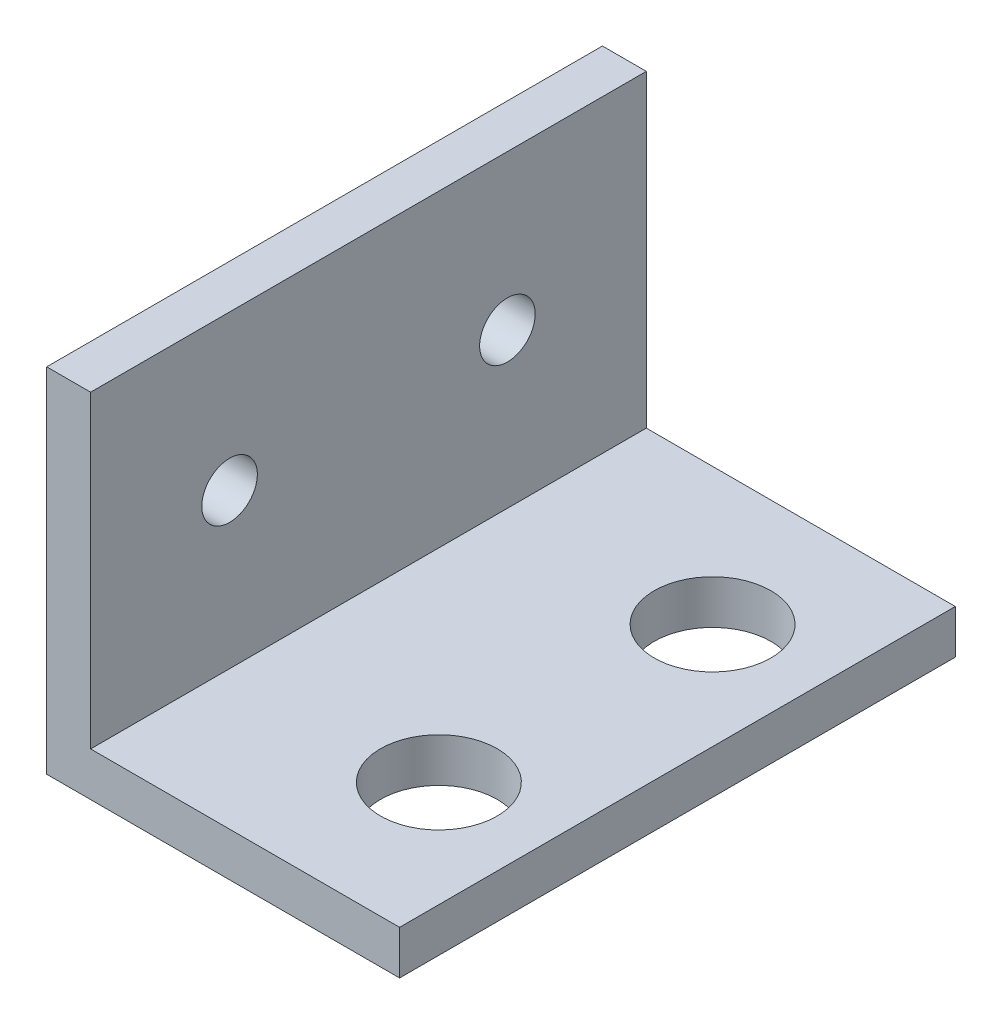
ISO-10303-21;
HEADER;
FILE_DESCRIPTION(('STEP AP214'),'2;1');
FILE_NAME('part.step','',(''),(''),'','','');
FILE_SCHEMA(('AUTOMOTIVE_DESIGN { 1 0 10303 214 1 1 1 1 }'));
ENDSEC;
DATA;
#1=APPLICATION_CONTEXT('core data for automotive mechanical design processes');
#2=APPLICATION_PROTOCOL_DEFINITION('international standard','automotive_design',2000,#1);
#3=PRODUCT_CONTEXT('',#1,'mechanical');
#4=PRODUCT('Part','Part','',(#3));
#5=PRODUCT_RELATED_PRODUCT_CATEGORY('part','',(#4));
#6=PRODUCT_DEFINITION_FORMATION('','',#4);
#7=PRODUCT_DEFINITION_CONTEXT('part definition',#1,'design');
#8=PRODUCT_DEFINITION('design','',#6,#7);
#9=PRODUCT_DEFINITION_SHAPE('','',#8);
#10=(LENGTH_UNIT() NAMED_UNIT(*) SI_UNIT(.MILLI.,.METRE.));
#11=(NAMED_UNIT(*) PLANE_ANGLE_UNIT() SI_UNIT($,.RADIAN.));
#12=(NAMED_UNIT(*) SI_UNIT($,.STERADIAN.) SOLID_ANGLE_UNIT());
#13=UNCERTAINTY_MEASURE_WITH_UNIT(LENGTH_MEASURE(1.E-05),#10,'distance_accuracy_value','');
#14=(GEOMETRIC_REPRESENTATION_CONTEXT(3) GLOBAL_UNCERTAINTY_ASSIGNED_CONTEXT((#13)) GLOBAL_UNIT_ASSIGNED_CONTEXT((#10,
#11,#12)) REPRESENTATION_CONTEXT('',''));
#15=CARTESIAN_POINT('',(0.,0.,0.));
#16=DIRECTION('',(0.,0.,1.));
#17=DIRECTION('',(1.,0.,0.));
#18=AXIS2_PLACEMENT_3D('',#15,#16,#17);
#19=CARTESIAN_POINT('',(0.,0.,20.));
#20=DIRECTION('',(0.,1.,0.));
#21=DIRECTION('',(0.,0.,1.));
#22=AXIS2_PLACEMENT_3D('',#19,#20,#21);
#23=PLANE('',#22);
#24=CARTESIAN_POINT('',(8.88885438200887,0.,4.9250000000029));
#25=DIRECTION('',(0.,-1.,0.));
#26=DIRECTION('',(0.,0.,-1.));
#27=AXIS2_PLACEMENT_3D('',#24,#25,#26);
#28=CIRCLE('',#27,2.10000000000005);
#29=CARTESIAN_POINT('',(8.88885438200887,0.,2.82500000000285));
#30=VERTEX_POINT('',#29);
#31=EDGE_CURVE('E166',#30,#30,#28,.T.);
#32=ORIENTED_EDGE('',*,*,#31,.F.);
#33=EDGE_LOOP('',(#32));
#34=FACE_BOUND('',#33,.T.);
#35=CARTESIAN_POINT('',(8.88885438200895,0.,14.7750000000034));
#36=DIRECTION('',(0.,-1.,0.));
#37=DIRECTION('',(0.,0.,-1.));
#38=AXIS2_PLACEMENT_3D('',#35,#36,#37);
#39=CIRCLE('',#38,2.10000000000014);
#40=CARTESIAN_POINT('',(8.88885438200895,0.,12.6750000000033));
#41=VERTEX_POINT('',#40);
#42=EDGE_CURVE('E169',#41,#41,#39,.T.);
#43=ORIENTED_EDGE('',*,*,#42,.F.);
#44=EDGE_LOOP('',(#43));
#45=FACE_BOUND('',#44,.T.);
#46=DIRECTION('',(1.,0.,0.));
#47=VECTOR('',#46,1.);
#48=CARTESIAN_POINT('',(0.,0.,0.));
#49=LINE('',#48,#47);
#50=CARTESIAN_POINT('',(0.,0.,0.));
#51=VERTEX_POINT('',#50);
#52=CARTESIAN_POINT('',(12.7,0.,0.));
#53=VERTEX_POINT('',#52);
#54=EDGE_CURVE('E120',#51,#53,#49,.T.);
#55=ORIENTED_EDGE('',*,*,#54,.T.);
#56=DIRECTION('',(0.,0.,-1.));
#57=VECTOR('',#56,1.);
#58=CARTESIAN_POINT('',(12.7,0.,20.));
#59=LINE('',#58,#57);
#60=CARTESIAN_POINT('',(12.7,0.,20.));
#61=VERTEX_POINT('',#60);
#62=EDGE_CURVE('E11',#61,#53,#59,.T.);
#63=ORIENTED_EDGE('',*,*,#62,.F.);
#64=DIRECTION('',(1.,0.,0.));
#65=VECTOR('',#64,1.);
#66=CARTESIAN_POINT('',(0.,0.,20.));
#67=LINE('',#66,#65);
#68=CARTESIAN_POINT('',(0.,0.,20.));
#69=VERTEX_POINT('',#68);
#70=EDGE_CURVE('E131',#69,#61,#67,.T.);
#71=ORIENTED_EDGE('',*,*,#70,.F.);
#72=DIRECTION('',(0.,0.,-1.));
#73=VECTOR('',#72,1.);
#74=CARTESIAN_POINT('',(0.,0.,20.));
#75=LINE('',#74,#73);
#76=EDGE_CURVE('E116',#69,#51,#75,.T.);
#77=ORIENTED_EDGE('',*,*,#76,.T.);
#78=EDGE_LOOP('',(#55,#63,#71,#77));
#79=FACE_BOUND('',#78,.T.);
#80=ADVANCED_FACE('F36',(#34,#45,#79),#23,.F.);
#81=CARTESIAN_POINT('',(12.7,1.58,20.));
#82=DIRECTION('',(-1.,0.,0.));
#83=DIRECTION('',(0.,0.,1.));
#84=AXIS2_PLACEMENT_3D('',#81,#82,#83);
#85=PLANE('',#84);
#86=DIRECTION('',(0.,1.,0.));
#87=VECTOR('',#86,1.);
#88=CARTESIAN_POINT('',(12.7,1.58,0.));
#89=LINE('',#88,#87);
#90=CARTESIAN_POINT('',(12.7,1.58,0.));
#91=VERTEX_POINT('',#90);
#92=EDGE_CURVE('E123',#53,#91,#89,.T.);
#93=ORIENTED_EDGE('',*,*,#92,.T.);
#94=DIRECTION('',(0.,0.,-1.));
#95=VECTOR('',#94,1.);
#96=CARTESIAN_POINT('',(12.7,1.58,20.));
#97=LINE('',#96,#95);
#98=CARTESIAN_POINT('',(12.7,1.58,20.));
#99=VERTEX_POINT('',#98);
#100=EDGE_CURVE('E44',#99,#91,#97,.T.);
#101=ORIENTED_EDGE('',*,*,#100,.F.);
#102=DIRECTION('',(0.,1.,0.));
#103=VECTOR('',#102,1.);
#104=CARTESIAN_POINT('',(12.7,1.58,20.));
#105=LINE('',#104,#103);
#106=EDGE_CURVE('E89',#61,#99,#105,.T.);
#107=ORIENTED_EDGE('',*,*,#106,.F.);
#108=ORIENTED_EDGE('',*,*,#62,.T.);
#109=EDGE_LOOP('',(#93,#101,#107,#108));
#110=FACE_BOUND('',#109,.T.);
#111=ADVANCED_FACE('F158',(#110),#85,.F.);
#112=CARTESIAN_POINT('',(1.58,1.58,20.));
#113=DIRECTION('',(0.,-1.,0.));
#114=DIRECTION('',(0.,0.,-1.));
#115=AXIS2_PLACEMENT_3D('',#112,#113,#114);
#116=PLANE('',#115);
#117=CARTESIAN_POINT('',(8.88885438200887,1.58,4.9250000000029));
#118=DIRECTION('',(0.,-1.,0.));
#119=DIRECTION('',(0.,0.,-1.));
#120=AXIS2_PLACEMENT_3D('',#117,#118,#119);
#121=CIRCLE('',#120,2.10000000000005);
#122=CARTESIAN_POINT('',(8.88885438200887,1.58,2.82500000000285));
#123=VERTEX_POINT('',#122);
#124=EDGE_CURVE('E176',#123,#123,#121,.F.);
#125=ORIENTED_EDGE('',*,*,#124,.F.);
#126=EDGE_LOOP('',(#125));
#127=FACE_BOUND('',#126,.T.);
#128=CARTESIAN_POINT('',(8.88885438200895,1.58,14.7750000000034));
#129=DIRECTION('',(0.,-1.,0.));
#130=DIRECTION('',(0.,0.,-1.));
#131=AXIS2_PLACEMENT_3D('',#128,#129,#130);
#132=CIRCLE('',#131,2.10000000000014);
#133=CARTESIAN_POINT('',(8.88885438200895,1.58,12.6750000000033));
#134=VERTEX_POINT('',#133);
#135=EDGE_CURVE('E171',#134,#134,#132,.F.);
#136=ORIENTED_EDGE('',*,*,#135,.F.);
#137=EDGE_LOOP('',(#136));
#138=FACE_BOUND('',#137,.T.);
#139=DIRECTION('',(-1.,0.,0.));
#140=VECTOR('',#139,1.);
#141=CARTESIAN_POINT('',(1.58,1.58,0.));
#142=LINE('',#141,#140);
#143=CARTESIAN_POINT('',(1.58,1.58,0.));
#144=VERTEX_POINT('',#143);
#145=EDGE_CURVE('E126',#91,#144,#142,.T.);
#146=ORIENTED_EDGE('',*,*,#145,.T.);
#147=DIRECTION('',(0.,0.,-1.));
#148=VECTOR('',#147,1.);
#149=CARTESIAN_POINT('',(1.58,1.58,20.));
#150=LINE('',#149,#148);
#151=CARTESIAN_POINT('',(1.58,1.58,20.));
#152=VERTEX_POINT('',#151);
#153=EDGE_CURVE('E111',#152,#144,#150,.T.);
#154=ORIENTED_EDGE('',*,*,#153,.F.);
#155=DIRECTION('',(-1.,0.,0.));
#156=VECTOR('',#155,1.);
#157=CARTESIAN_POINT('',(1.58,1.58,20.));
#158=LINE('',#157,#156);
#159=EDGE_CURVE('E102',#99,#152,#158,.T.);
#160=ORIENTED_EDGE('',*,*,#159,.F.);
#161=ORIENTED_EDGE('',*,*,#100,.T.);
#162=EDGE_LOOP('',(#146,#154,#160,#161));
#163=FACE_BOUND('',#162,.T.);
#164=ADVANCED_FACE('F137',(#127,#138,#163),#116,.F.);
#165=CARTESIAN_POINT('',(1.58,1.58,20.));
#166=DIRECTION('',(-1.,0.,0.));
#167=DIRECTION('',(0.,0.,1.));
#168=AXIS2_PLACEMENT_3D('',#165,#166,#167);
#169=PLANE('',#168);
#170=CARTESIAN_POINT('',(1.58,7.14,5.));
#171=DIRECTION('',(-1.,0.,0.));
#172=DIRECTION('',(0.,0.,1.));
#173=AXIS2_PLACEMENT_3D('',#170,#171,#172);
#174=CIRCLE('',#173,1.);
#175=CARTESIAN_POINT('',(1.58,7.14,6.));
#176=VERTEX_POINT('',#175);
#177=EDGE_CURVE('E124',#176,#176,#174,.F.);
#178=ORIENTED_EDGE('',*,*,#177,.F.);
#179=EDGE_LOOP('',(#178));
#180=FACE_BOUND('',#179,.T.);
#181=CARTESIAN_POINT('',(1.58,7.14,15.));
#182=DIRECTION('',(-1.,0.,0.));
#183=DIRECTION('',(0.,0.,1.));
#184=AXIS2_PLACEMENT_3D('',#181,#182,#183);
#185=CIRCLE('',#184,1.);
#186=CARTESIAN_POINT('',(1.58,7.14,16.));
#187=VERTEX_POINT('',#186);
#188=EDGE_CURVE('E182',#187,#187,#185,.F.);
#189=ORIENTED_EDGE('',*,*,#188,.F.);
#190=EDGE_LOOP('',(#189));
#191=FACE_BOUND('',#190,.T.);
#192=DIRECTION('',(0.,1.,0.));
#193=VECTOR('',#192,1.);
#194=CARTESIAN_POINT('',(1.58,1.58,0.));
#195=LINE('',#194,#193);
#196=CARTESIAN_POINT('',(1.58,12.7,0.));
#197=VERTEX_POINT('',#196);
#198=EDGE_CURVE('E110',#144,#197,#195,.T.);
#199=ORIENTED_EDGE('',*,*,#198,.T.);
#200=DIRECTION('',(0.,0.,-1.));
#201=VECTOR('',#200,1.);
#202=CARTESIAN_POINT('',(1.58,12.7,20.));
#203=LINE('',#202,#201);
#204=CARTESIAN_POINT('',(1.58,12.7,20.));
#205=VERTEX_POINT('',#204);
#206=EDGE_CURVE('E107',#205,#197,#203,.T.);
#207=ORIENTED_EDGE('',*,*,#206,.F.);
#208=DIRECTION('',(0.,1.,0.));
#209=VECTOR('',#208,1.);
#210=CARTESIAN_POINT('',(1.58,1.58,20.));
#211=LINE('',#210,#209);
#212=EDGE_CURVE('E96',#152,#205,#211,.T.);
#213=ORIENTED_EDGE('',*,*,#212,.F.);
#214=ORIENTED_EDGE('',*,*,#153,.T.);
#215=EDGE_LOOP('',(#199,#207,#213,#214));
#216=FACE_BOUND('',#215,.T.);
#217=ADVANCED_FACE('F108',(#180,#191,#216),#169,.F.);
#218=CARTESIAN_POINT('',(0.,12.7,20.));
#219=DIRECTION('',(0.,-1.,0.));
#220=DIRECTION('',(0.,0.,-1.));
#221=AXIS2_PLACEMENT_3D('',#218,#219,#220);
#222=PLANE('',#221);
#223=DIRECTION('',(-1.,0.,0.));
#224=VECTOR('',#223,1.);
#225=CARTESIAN_POINT('',(0.,12.7,0.));
#226=LINE('',#225,#224);
#227=CARTESIAN_POINT('',(0.,12.7,0.));
#228=VERTEX_POINT('',#227);
#229=EDGE_CURVE('E75',#197,#228,#226,.T.);
#230=ORIENTED_EDGE('',*,*,#229,.T.);
#231=DIRECTION('',(0.,0.,-1.));
#232=VECTOR('',#231,1.);
#233=CARTESIAN_POINT('',(0.,12.7,20.));
#234=LINE('',#233,#232);
#235=CARTESIAN_POINT('',(0.,12.7,20.));
#236=VERTEX_POINT('',#235);
#237=EDGE_CURVE('E112',#236,#228,#234,.T.);
#238=ORIENTED_EDGE('',*,*,#237,.F.);
#239=DIRECTION('',(-1.,0.,0.));
#240=VECTOR('',#239,1.);
#241=CARTESIAN_POINT('',(0.,12.7,20.));
#242=LINE('',#241,#240);
#243=EDGE_CURVE('E100',#205,#236,#242,.T.);
#244=ORIENTED_EDGE('',*,*,#243,.F.);
#245=ORIENTED_EDGE('',*,*,#206,.T.);
#246=EDGE_LOOP('',(#230,#238,#244,#245));
#247=FACE_BOUND('',#246,.T.);
#248=ADVANCED_FACE('F114',(#247),#222,.F.);
#249=CARTESIAN_POINT('',(0.,0.,20.));
#250=DIRECTION('',(1.,0.,0.));
#251=DIRECTION('',(0.,0.,-1.));
#252=AXIS2_PLACEMENT_3D('',#249,#250,#251);
#253=PLANE('',#252);
#254=CARTESIAN_POINT('',(0.,7.14,5.));
#255=DIRECTION('',(-1.,0.,0.));
#256=DIRECTION('',(0.,0.,1.));
#257=AXIS2_PLACEMENT_3D('',#254,#255,#256);
#258=CIRCLE('',#257,1.);
#259=CARTESIAN_POINT('',(0.,7.14,6.));
#260=VERTEX_POINT('',#259);
#261=EDGE_CURVE('E179',#260,#260,#258,.T.);
#262=ORIENTED_EDGE('',*,*,#261,.F.);
#263=EDGE_LOOP('',(#262));
#264=FACE_BOUND('',#263,.T.);
#265=CARTESIAN_POINT('',(0.,7.14,15.));
#266=DIRECTION('',(-1.,0.,0.));
#267=DIRECTION('',(0.,0.,1.));
#268=AXIS2_PLACEMENT_3D('',#265,#266,#267);
#269=CIRCLE('',#268,1.);
#270=CARTESIAN_POINT('',(0.,7.14,16.));
#271=VERTEX_POINT('',#270);
#272=EDGE_CURVE('E185',#271,#271,#269,.T.);
#273=ORIENTED_EDGE('',*,*,#272,.F.);
#274=EDGE_LOOP('',(#273));
#275=FACE_BOUND('',#274,.T.);
#276=DIRECTION('',(0.,-1.,0.));
#277=VECTOR('',#276,1.);
#278=CARTESIAN_POINT('',(0.,0.,0.));
#279=LINE('',#278,#277);
#280=EDGE_CURVE('E81',#228,#51,#279,.T.);
#281=ORIENTED_EDGE('',*,*,#280,.T.);
#282=ORIENTED_EDGE('',*,*,#76,.F.);
#283=DIRECTION('',(0.,-1.,0.));
#284=VECTOR('',#283,1.);
#285=CARTESIAN_POINT('',(0.,0.,20.));
#286=LINE('',#285,#284);
#287=EDGE_CURVE('E52',#236,#69,#286,.T.);
#288=ORIENTED_EDGE('',*,*,#287,.F.);
#289=ORIENTED_EDGE('',*,*,#237,.T.);
#290=EDGE_LOOP('',(#281,#282,#288,#289));
#291=FACE_BOUND('',#290,.T.);
#292=ADVANCED_FACE('F144',(#264,#275,#291),#253,.F.);
#293=CARTESIAN_POINT('',(0.,0.,20.));
#294=DIRECTION('',(0.,0.,-1.));
#295=DIRECTION('',(-1.,0.,0.));
#296=AXIS2_PLACEMENT_3D('',#293,#294,#295);
#297=PLANE('',#296);
#298=ORIENTED_EDGE('',*,*,#70,.T.);
#299=ORIENTED_EDGE('',*,*,#106,.T.);
#300=ORIENTED_EDGE('',*,*,#159,.T.);
#301=ORIENTED_EDGE('',*,*,#212,.T.);
#302=ORIENTED_EDGE('',*,*,#243,.T.);
#303=ORIENTED_EDGE('',*,*,#287,.T.);
#304=EDGE_LOOP('',(#298,#299,#300,#301,#302,#303));
#305=FACE_BOUND('',#304,.T.);
#306=ADVANCED_FACE('F98',(#305),#297,.F.);
#307=CARTESIAN_POINT('',(0.,0.,0.));
#308=DIRECTION('',(0.,0.,-1.));
#309=DIRECTION('',(-1.,0.,0.));
#310=AXIS2_PLACEMENT_3D('',#307,#308,#309);
#311=PLANE('',#310);
#312=ORIENTED_EDGE('',*,*,#54,.F.);
#313=ORIENTED_EDGE('',*,*,#280,.F.);
#314=ORIENTED_EDGE('',*,*,#229,.F.);
#315=ORIENTED_EDGE('',*,*,#198,.F.);
#316=ORIENTED_EDGE('',*,*,#145,.F.);
#317=ORIENTED_EDGE('',*,*,#92,.F.);
#318=EDGE_LOOP('',(#312,#313,#314,#315,#316,#317));
#319=FACE_BOUND('',#318,.T.);
#320=ADVANCED_FACE('F140',(#319),#311,.T.);
#321=CARTESIAN_POINT('',(12.701,7.14,15.));
#322=DIRECTION('',(-1.,0.,0.));
#323=DIRECTION('',(0.,0.,1.));
#324=AXIS2_PLACEMENT_3D('',#321,#322,#323);
#325=CYLINDRICAL_SURFACE('',#324,1.);
#326=ORIENTED_EDGE('',*,*,#272,.T.);
#327=EDGE_LOOP('',(#326));
#328=FACE_BOUND('',#327,.T.);
#329=ORIENTED_EDGE('',*,*,#188,.T.);
#330=EDGE_LOOP('',(#329));
#331=FACE_BOUND('',#330,.T.);
#332=ADVANCED_FACE('F193',(#328,#331),#325,.F.);
#333=CARTESIAN_POINT('',(12.701,7.14,5.));
#334=DIRECTION('',(-1.,0.,0.));
#335=DIRECTION('',(0.,0.,1.));
#336=AXIS2_PLACEMENT_3D('',#333,#334,#335);
#337=CYLINDRICAL_SURFACE('',#336,1.);
#338=ORIENTED_EDGE('',*,*,#261,.T.);
#339=EDGE_LOOP('',(#338));
#340=FACE_BOUND('',#339,.T.);
#341=ORIENTED_EDGE('',*,*,#177,.T.);
#342=EDGE_LOOP('',(#341));
#343=FACE_BOUND('',#342,.T.);
#344=ADVANCED_FACE('F205',(#340,#343),#337,.F.);
#345=CARTESIAN_POINT('',(8.88885438200895,12.701,14.7750000000034));
#346=DIRECTION('',(0.,-1.,0.));
#347=DIRECTION('',(0.,0.,-1.));
#348=AXIS2_PLACEMENT_3D('',#345,#346,#347);
#349=CYLINDRICAL_SURFACE('',#348,2.10000000000014);
#350=ORIENTED_EDGE('',*,*,#42,.T.);
#351=EDGE_LOOP('',(#350));
#352=FACE_BOUND('',#351,.T.);
#353=ORIENTED_EDGE('',*,*,#135,.T.);
#354=EDGE_LOOP('',(#353));
#355=FACE_BOUND('',#354,.T.);
#356=ADVANCED_FACE('F207',(#352,#355),#349,.F.);
#357=CARTESIAN_POINT('',(8.88885438200887,12.701,4.9250000000029));
#358=DIRECTION('',(0.,-1.,0.));
#359=DIRECTION('',(0.,0.,-1.));
#360=AXIS2_PLACEMENT_3D('',#357,#358,#359);
#361=CYLINDRICAL_SURFACE('',#360,2.10000000000005);
#362=ORIENTED_EDGE('',*,*,#31,.T.);
#363=EDGE_LOOP('',(#362));
#364=FACE_BOUND('',#363,.T.);
#365=ORIENTED_EDGE('',*,*,#124,.T.);
#366=EDGE_LOOP('',(#365));
#367=FACE_BOUND('',#366,.T.);
#368=ADVANCED_FACE('F214',(#364,#367),#361,.F.);
#369=CLOSED_SHELL('',(#80,#111,#164,#217,#248,#292,#306,#320,#332,#344,#356,#368));
#370=MANIFOLD_SOLID_BREP('B2',#369);
#371=ADVANCED_BREP_SHAPE_REPRESENTATION('',(#18,#370),#14);
#372=SHAPE_DEFINITION_REPRESENTATION(#9,#371);
ENDSEC;
END-ISO-10303-21;
